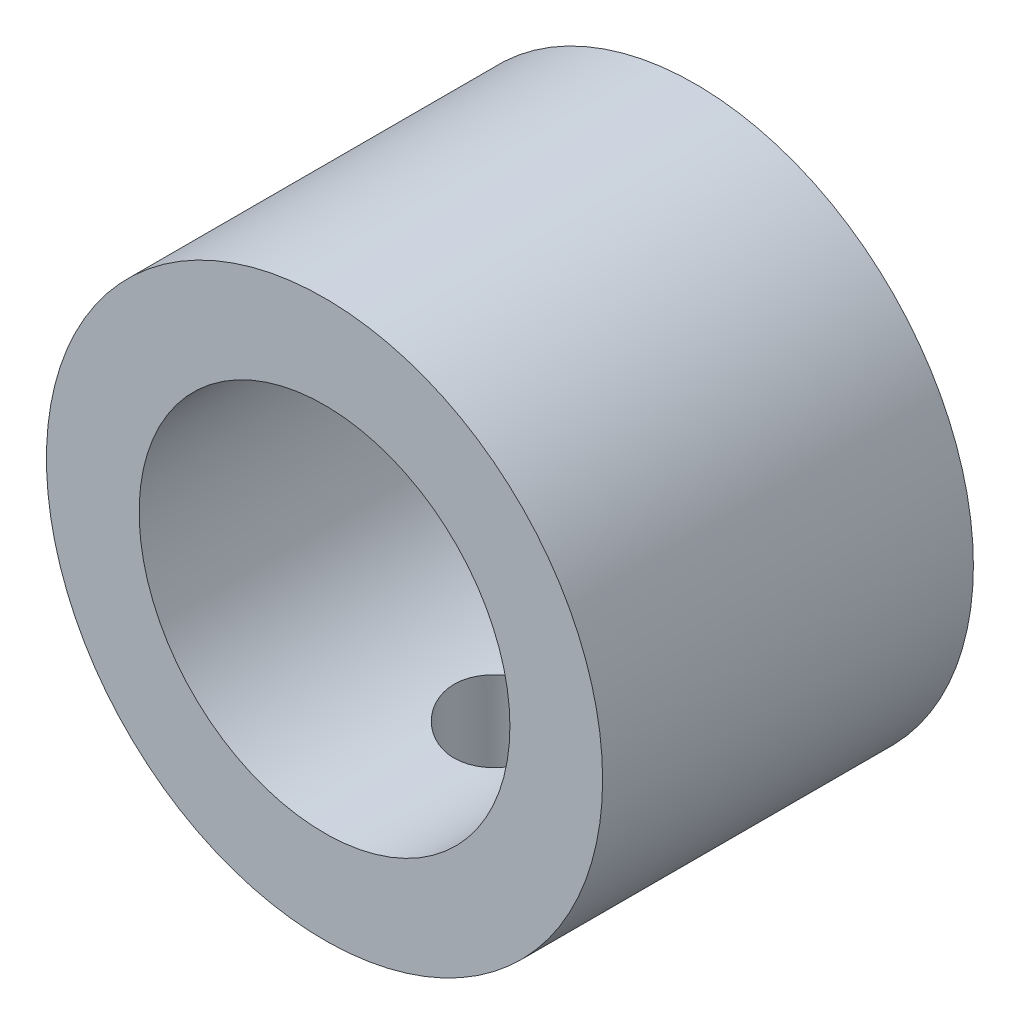
ISO-10303-21;
HEADER;
FILE_DESCRIPTION(('STEP AP214'),'2;1');
FILE_NAME('part.step','',(''),(''),'','','');
FILE_SCHEMA(('AUTOMOTIVE_DESIGN { 1 0 10303 214 1 1 1 1 }'));
ENDSEC;
DATA;
#1=APPLICATION_CONTEXT('core data for automotive mechanical design processes');
#2=APPLICATION_PROTOCOL_DEFINITION('international standard','automotive_design',2000,#1);
#3=PRODUCT_CONTEXT('',#1,'mechanical');
#4=PRODUCT('Part','Part','',(#3));
#5=PRODUCT_RELATED_PRODUCT_CATEGORY('part','',(#4));
#6=PRODUCT_DEFINITION_FORMATION('','',#4);
#7=PRODUCT_DEFINITION_CONTEXT('part definition',#1,'design');
#8=PRODUCT_DEFINITION('design','',#6,#7);
#9=PRODUCT_DEFINITION_SHAPE('','',#8);
#10=(LENGTH_UNIT() NAMED_UNIT(*) SI_UNIT(.MILLI.,.METRE.));
#11=(NAMED_UNIT(*) PLANE_ANGLE_UNIT() SI_UNIT($,.RADIAN.));
#12=(NAMED_UNIT(*) SI_UNIT($,.STERADIAN.) SOLID_ANGLE_UNIT());
#13=UNCERTAINTY_MEASURE_WITH_UNIT(LENGTH_MEASURE(1.E-05),#10,'distance_accuracy_value','');
#14=(GEOMETRIC_REPRESENTATION_CONTEXT(3) GLOBAL_UNCERTAINTY_ASSIGNED_CONTEXT((#13)) GLOBAL_UNIT_ASSIGNED_CONTEXT((#10,
#11,#12)) REPRESENTATION_CONTEXT('',''));
#15=CARTESIAN_POINT('',(0.,0.,0.));
#16=DIRECTION('',(0.,0.,1.));
#17=DIRECTION('',(1.,0.,0.));
#18=AXIS2_PLACEMENT_3D('',#15,#16,#17);
#19=CARTESIAN_POINT('',(0.,0.,5.));
#20=DIRECTION('',(0.,0.,1.));
#21=DIRECTION('',(1.,0.,0.));
#22=AXIS2_PLACEMENT_3D('',#19,#20,#21);
#23=PLANE('',#22);
#24=CARTESIAN_POINT('',(0.,0.,5.));
#25=DIRECTION('',(0.,0.,1.));
#26=DIRECTION('',(1.,0.,0.));
#27=AXIS2_PLACEMENT_3D('',#24,#25,#26);
#28=CIRCLE('',#27,7.5);
#29=CARTESIAN_POINT('',(7.5,0.,5.));
#30=VERTEX_POINT('',#29);
#31=EDGE_CURVE('E11',#30,#30,#28,.T.);
#32=ORIENTED_EDGE('',*,*,#31,.T.);
#33=EDGE_LOOP('',(#32));
#34=FACE_BOUND('',#33,.T.);
#35=CARTESIAN_POINT('',(0.,0.,5.));
#36=DIRECTION('',(0.,0.,1.));
#37=DIRECTION('',(1.,0.,0.));
#38=AXIS2_PLACEMENT_3D('',#35,#36,#37);
#39=CIRCLE('',#38,5.);
#40=CARTESIAN_POINT('',(5.,0.,5.));
#41=VERTEX_POINT('',#40);
#42=EDGE_CURVE('E55',#41,#41,#39,.T.);
#43=ORIENTED_EDGE('',*,*,#42,.F.);
#44=EDGE_LOOP('',(#43));
#45=FACE_BOUND('',#44,.T.);
#46=ADVANCED_FACE('F37',(#34,#45),#23,.T.);
#47=CARTESIAN_POINT('',(0.,0.,-5.));
#48=DIRECTION('',(0.,0.,1.));
#49=DIRECTION('',(1.,0.,0.));
#50=AXIS2_PLACEMENT_3D('',#47,#48,#49);
#51=PLANE('',#50);
#52=CARTESIAN_POINT('',(0.,0.,-5.));
#53=DIRECTION('',(0.,0.,1.));
#54=DIRECTION('',(1.,0.,0.));
#55=AXIS2_PLACEMENT_3D('',#52,#53,#54);
#56=CIRCLE('',#55,7.5);
#57=CARTESIAN_POINT('',(7.5,0.,-5.));
#58=VERTEX_POINT('',#57);
#59=EDGE_CURVE('E50',#58,#58,#56,.T.);
#60=ORIENTED_EDGE('',*,*,#59,.F.);
#61=EDGE_LOOP('',(#60));
#62=FACE_BOUND('',#61,.T.);
#63=CARTESIAN_POINT('',(0.,0.,-5.));
#64=DIRECTION('',(0.,0.,1.));
#65=DIRECTION('',(1.,0.,0.));
#66=AXIS2_PLACEMENT_3D('',#63,#64,#65);
#67=CIRCLE('',#66,5.);
#68=CARTESIAN_POINT('',(5.,0.,-5.));
#69=VERTEX_POINT('',#68);
#70=EDGE_CURVE('E57',#69,#69,#67,.T.);
#71=ORIENTED_EDGE('',*,*,#70,.T.);
#72=EDGE_LOOP('',(#71));
#73=FACE_BOUND('',#72,.T.);
#74=ADVANCED_FACE('F77',(#62,#73),#51,.F.);
#75=CARTESIAN_POINT('',(0.,0.,5.));
#76=DIRECTION('',(0.,0.,-1.));
#77=DIRECTION('',(-1.,0.,0.));
#78=AXIS2_PLACEMENT_3D('',#75,#76,#77);
#79=CYLINDRICAL_SURFACE('',#78,7.5);
#80=CARTESIAN_POINT('',(0.,-7.5,1.5));
#81=CARTESIAN_POINT('',(-0.0833653601889498,-7.49999846371307,1.49999693325248));
#82=CARTESIAN_POINT('',(-0.166769490302284,-7.49859577767346,1.49302673554853));
#83=CARTESIAN_POINT('',(-0.331220261533529,-7.49313548434847,1.46535224982713));
#84=CARTESIAN_POINT('',(-0.412264976312034,-7.48907576790279,1.44463705079774));
#85=CARTESIAN_POINT('',(-0.569595457894969,-7.4787547391743,1.39013808956882));
#86=CARTESIAN_POINT('',(-0.645885701899701,-7.47249553615077,1.35636684473297));
#87=CARTESIAN_POINT('',(-0.791711983296338,-7.45845597052971,1.27675162873306));
#88=CARTESIAN_POINT('',(-0.861248422613718,-7.4506756985356,1.23090837658919));
#89=CARTESIAN_POINT('',(-0.992540215972297,-7.43433247994955,1.12779225856285));
#90=CARTESIAN_POINT('',(-1.05419092673779,-7.42576118256521,1.0703874669132));
#91=CARTESIAN_POINT('',(-1.16705513491204,-7.40886270678882,0.946061375412447));
#92=CARTESIAN_POINT('',(-1.21826781715564,-7.40053554750636,0.879139332997323));
#93=CARTESIAN_POINT('',(-1.30924763002143,-7.38498662718923,0.736925710482187));
#94=CARTESIAN_POINT('',(-1.3489064082988,-7.37777561047419,0.661563534305461));
#95=CARTESIAN_POINT('',(-1.41495849987046,-7.36539402087627,0.505077271493881));
#96=CARTESIAN_POINT('',(-1.44135312365586,-7.36022324642942,0.423953754980482));
#97=CARTESIAN_POINT('',(-1.47978794982724,-7.35259207878307,0.259373454138124));
#98=CARTESIAN_POINT('',(-1.49201174693817,-7.35009705160781,0.175961183786661));
#99=CARTESIAN_POINT('',(-1.50232819158918,-7.34799562590941,0.00823526795348636));
#100=CARTESIAN_POINT('',(-1.50042228407025,-7.34838893201761,-0.0760782844802178));
#101=CARTESIAN_POINT('',(-1.48268185965273,-7.35198826722277,-0.241870182031505));
#102=CARTESIAN_POINT('',(-1.46705781036586,-7.35515179288145,-0.323372108440971));
#103=CARTESIAN_POINT('',(-1.42265682693458,-7.36386819240002,-0.482574114994503));
#104=CARTESIAN_POINT('',(-1.39387926465102,-7.36942118036668,-0.560274013378512));
#105=CARTESIAN_POINT('',(-1.32378717551208,-7.38233427750612,-0.710272892555398));
#106=CARTESIAN_POINT('',(-1.28238922684817,-7.38970634720557,-0.782531819353757));
#107=CARTESIAN_POINT('',(-1.18829036185902,-7.40541928159593,-0.919156274959221));
#108=CARTESIAN_POINT('',(-1.13558814653524,-7.41376025757549,-0.983520895276736));
#109=CARTESIAN_POINT('',(-1.01924990184088,-7.43065531862193,-1.1037441036854));
#110=CARTESIAN_POINT('',(-0.955434241818668,-7.43921053816357,-1.1594288517887));
#111=CARTESIAN_POINT('',(-0.819277536093015,-7.45543273071613,-1.25933076945184));
#112=CARTESIAN_POINT('',(-0.746936381069084,-7.4630996923346,-1.30354779194037));
#113=CARTESIAN_POINT('',(-0.595589080318381,-7.47670035241331,-1.37929126383896));
#114=CARTESIAN_POINT('',(-0.51657272937795,-7.48263133272408,-1.41079784046681));
#115=CARTESIAN_POINT('',(-0.354223464672997,-7.49207113481787,-1.46004071105785));
#116=CARTESIAN_POINT('',(-0.270891075108675,-7.49558025000797,-1.47777867311044));
#117=CARTESIAN_POINT('',(-0.103769108440726,-7.49974007800302,-1.49873468069142));
#118=CARTESIAN_POINT('',(-0.0200104924883644,-7.50043761978705,-1.5021906293104));
#119=CARTESIAN_POINT('',(0.146887401289071,-7.49902577895154,-1.49512521158673));
#120=CARTESIAN_POINT('',(0.23002671366569,-7.49691655412169,-1.48460463097111));
#121=CARTESIAN_POINT('',(0.392558489919811,-7.49015748012026,-1.45008243968407));
#122=CARTESIAN_POINT('',(0.471977922509855,-7.4855306460631,-1.42620289725315));
#123=CARTESIAN_POINT('',(0.625685441249501,-7.47425328091549,-1.36577402601629));
#124=CARTESIAN_POINT('',(0.699973142456309,-7.4676025982134,-1.32922374798476));
#125=CARTESIAN_POINT('',(0.842311760529326,-7.45289867299942,-1.24397626402303));
#126=CARTESIAN_POINT('',(0.910275190128282,-7.44482925655578,-1.19513582844158));
#127=CARTESIAN_POINT('',(1.03712702867881,-7.42822102244824,-1.08688621318908));
#128=CARTESIAN_POINT('',(1.09601446339614,-7.41968215452582,-1.0274759004002));
#129=CARTESIAN_POINT('',(1.20396088616126,-7.40293955335447,-0.898689972163314));
#130=CARTESIAN_POINT('',(1.25285655367298,-7.39474290349956,-0.829176383667994));
#131=CARTESIAN_POINT('',(1.33827813007681,-7.37976287694291,-0.682782957964981));
#132=CARTESIAN_POINT('',(1.37480453388435,-7.37297944370014,-0.605903415639671));
#133=CARTESIAN_POINT('',(1.43422776237294,-7.36165110876574,-0.447347630775677));
#134=CARTESIAN_POINT('',(1.45719524968658,-7.3570946230828,-0.365698738184521));
#135=CARTESIAN_POINT('',(1.48906297744079,-7.35071155188038,-0.199599819763642));
#136=CARTESIAN_POINT('',(1.49796505233767,-7.34888461036667,-0.115150160685979));
#137=CARTESIAN_POINT('',(1.5013813663012,-7.34818724447069,0.0525132968164782));
#138=CARTESIAN_POINT('',(1.49615368210634,-7.34926378783951,0.135721723390514));
#139=CARTESIAN_POINT('',(1.47202845615009,-7.35413360226921,0.30004747485754));
#140=CARTESIAN_POINT('',(1.45313102419395,-7.35792685150754,0.381164816542207));
#141=CARTESIAN_POINT('',(1.40231785274843,-7.36777896328738,0.538841566860818));
#142=CARTESIAN_POINT('',(1.37043376007602,-7.37383231528246,0.615411540753623));
#143=CARTESIAN_POINT('',(1.29458196690241,-7.38752572461255,0.762155581101662));
#144=CARTESIAN_POINT('',(1.25061325316232,-7.39516591498341,0.832329110587706));
#145=CARTESIAN_POINT('',(1.15095887217962,-7.41133440784838,0.965573358225471));
#146=CARTESIAN_POINT('',(1.09508683085277,-7.41987559364549,1.02850314790139));
#147=CARTESIAN_POINT('',(0.973596553519711,-7.43679122807932,1.14417930829376));
#148=CARTESIAN_POINT('',(0.907976080730003,-7.44516563794777,1.19692333547591));
#149=CARTESIAN_POINT('',(0.76802644363237,-7.46090748581957,1.29125196591967));
#150=CARTESIAN_POINT('',(0.693613326644752,-7.46826346828869,1.33271400492004));
#151=CARTESIAN_POINT('',(0.538749541411099,-7.481026876275,1.40247918389489));
#152=CARTESIAN_POINT('',(0.458304391294689,-7.48643605707924,1.43079418429874));
#153=CARTESIAN_POINT('',(0.314732233385669,-7.49364558893056,1.46797792206707));
#154=CARTESIAN_POINT('',(0.252422496020677,-7.49601454737677,1.47996479056164));
#155=CARTESIAN_POINT('',(0.1267492878151,-7.49919231209839,1.49597686853755));
#156=CARTESIAN_POINT('',(0.0633858506229286,-7.50000116809732,1.50000233176465));
#157=CARTESIAN_POINT('',(0.,-7.5,1.5));
#158=B_SPLINE_CURVE_WITH_KNOTS('',3,(#80,#81,#82,#83,#84,#85,#86,#87,#88,#89,#90,#91,#92,#93,
#94,#95,#96,#97,#98,#99,#100,#101,#102,#103,#104,#105,#106,#107,#108,#109,#110,#111,#112,#113,
#114,#115,#116,#117,#118,#119,#120,#121,#122,#123,#124,#125,#126,#127,#128,#129,#130,#131,#132,
#133,#134,#135,#136,#137,#138,#139,#140,#141,#142,#143,#144,#145,#146,#147,#148,#149,#150,#151,
#152,#153,#154,#155,#156,#157),.UNSPECIFIED.,.T.,.F.,(4,2,2,2,2,2,2,2,2,2,2,2,2,2,2,2,2,2,2,2,2,
2,2,2,2,2,2,2,2,2,2,2,2,2,2,2,2,2,4),(0.,0.249864195991888,0.499926976036985,0.749750602875513,
0.999559353346295,1.25239900516828,1.50525839512105,1.76041792508884,2.01555224047796,
2.26734277655381,2.51910756421838,2.76707590509417,3.01505608880594,3.26471235305389,
3.51439732124506,3.76857378737026,4.0227535130973,4.27732912281036,4.53187388547054,
4.78216103514398,5.03243411486801,5.28045680926085,5.52849808824034,5.77957599050038,
6.03068082518895,6.28560942868839,6.540527830852,6.79410571549085,7.04765052495622,
7.29659583851552,7.54553915238913,7.79387941879665,8.042240513728,8.29482114358715,
8.54745981799396,8.80274245013456,9.05779433276278,9.24778162934841,9.43776287056494),.UNSPECIFIED.);
#159=CARTESIAN_POINT('',(0.,-7.5,1.5));
#160=VERTEX_POINT('',#159);
#161=EDGE_CURVE('E62',#160,#160,#158,.T.);
#162=ORIENTED_EDGE('',*,*,#161,.F.);
#163=EDGE_LOOP('',(#162));
#164=FACE_BOUND('',#163,.T.);
#165=ORIENTED_EDGE('',*,*,#31,.F.);
#166=EDGE_LOOP('',(#165));
#167=FACE_BOUND('',#166,.T.);
#168=ORIENTED_EDGE('',*,*,#59,.T.);
#169=EDGE_LOOP('',(#168));
#170=FACE_BOUND('',#169,.T.);
#171=ADVANCED_FACE('F39',(#164,#167,#170),#79,.T.);
#172=CARTESIAN_POINT('',(0.,0.,5.));
#173=DIRECTION('',(0.,0.,-1.));
#174=DIRECTION('',(-1.,0.,0.));
#175=AXIS2_PLACEMENT_3D('',#172,#173,#174);
#176=CYLINDRICAL_SURFACE('',#175,5.);
#177=CARTESIAN_POINT('',(0.,-5.,1.5));
#178=CARTESIAN_POINT('',(0.0822886127532999,-4.9999992925055,1.49999900251511));
#179=CARTESIAN_POINT('',(0.164587318351529,-4.99794915693954,1.49320613637603));
#180=CARTESIAN_POINT('',(0.326788125304881,-4.98997105593691,1.4662786457779));
#181=CARTESIAN_POINT('',(0.40668950441142,-4.98404193389692,1.44614004197666));
#182=CARTESIAN_POINT('',(0.561732707754526,-4.96895552501836,1.39325398308974));
#183=CARTESIAN_POINT('',(0.636881364395373,-4.95980300250425,1.36052513038106));
#184=CARTESIAN_POINT('',(0.780624181053131,-4.93922109237645,1.28346390694416));
#185=CARTESIAN_POINT('',(0.849217467469669,-4.92779140192067,1.23912999260458));
#186=CARTESIAN_POINT('',(0.979871797183745,-4.90350737192774,1.13877599252733));
#187=CARTESIAN_POINT('',(1.04171807124434,-4.89062383657036,1.08248337411409));
#188=CARTESIAN_POINT('',(1.15524920923324,-4.86505834210442,0.960390770089816));
#189=CARTESIAN_POINT('',(1.20693236327441,-4.85237641724501,0.89458918787504));
#190=CARTESIAN_POINT('',(1.29980037723708,-4.82834113993772,0.753529246962389));
#191=CARTESIAN_POINT('',(1.34072309022213,-4.81702406663875,0.678091539009263));
#192=CARTESIAN_POINT('',(1.4092139477476,-4.79743620394031,0.521010745769708));
#193=CARTESIAN_POINT('',(1.43678529919973,-4.78916468313311,0.439369156072025));
#194=CARTESIAN_POINT('',(1.47701633682652,-4.77690870838434,0.27460973386954));
#195=CARTESIAN_POINT('',(1.49007196234677,-4.77281069324533,0.191597256136057));
#196=CARTESIAN_POINT('',(1.50213730614672,-4.76902789749767,0.0244668437832342));
#197=CARTESIAN_POINT('',(1.50115042761078,-4.76934204760571,-0.0596508180590877));
#198=CARTESIAN_POINT('',(1.48546977199812,-4.77424744067778,-0.223383908608484));
#199=CARTESIAN_POINT('',(1.47127205262685,-4.7786838859914,-0.303052250362239));
#200=CARTESIAN_POINT('',(1.43037420427056,-4.79108356228624,-0.45881978627346));
#201=CARTESIAN_POINT('',(1.40367284141641,-4.79904714132351,-0.534918627374333));
#202=CARTESIAN_POINT('',(1.33816026653682,-4.81772733074973,-0.682600349660739));
#203=CARTESIAN_POINT('',(1.29918816934642,-4.82848016115952,-0.754107083955262));
#204=CARTESIAN_POINT('',(1.21035222588683,-4.85150987000065,-0.889732022010192));
#205=CARTESIAN_POINT('',(1.16048574002588,-4.86378711746991,-0.953848429413778));
#206=CARTESIAN_POINT('',(1.04881290765546,-4.88911011297937,-1.07568619076202));
#207=CARTESIAN_POINT('',(0.986594907466972,-4.90216654310498,-1.13302866402967));
#208=CARTESIAN_POINT('',(0.853263259313967,-4.92712244063259,-1.23655398406425));
#209=CARTESIAN_POINT('',(0.782149051860888,-4.9390218351841,-1.28273612841443));
#210=CARTESIAN_POINT('',(0.632355038342803,-4.9604316006947,-1.36285992246473));
#211=CARTESIAN_POINT('',(0.55362774974795,-4.96992543668314,-1.39671751624986));
#212=CARTESIAN_POINT('',(0.391245415603519,-4.98533521832222,-1.45059959009963));
#213=CARTESIAN_POINT('',(0.307591751589581,-4.99125216186999,-1.47062792853249));
#214=CARTESIAN_POINT('',(0.140952242668331,-4.99868364643538,-1.49565217789939));
#215=CARTESIAN_POINT('',(0.0580500976011868,-5.0003485041779,-1.50116158580161));
#216=CARTESIAN_POINT('',(-0.107499605823383,-4.9995292324176,-1.49843084428792));
#217=CARTESIAN_POINT('',(-0.190147196690781,-4.99704565677756,-1.49019253034856));
#218=CARTESIAN_POINT('',(-0.350903605309697,-4.98830696987163,-1.4606153888885));
#219=CARTESIAN_POINT('',(-0.429072772614169,-4.98213829799417,-1.43957661241913));
#220=CARTESIAN_POINT('',(-0.580754638954522,-4.96674347841532,-1.3853567672218));
#221=CARTESIAN_POINT('',(-0.654266777025583,-4.95751696321085,-1.35217423896214));
#222=CARTESIAN_POINT('',(-0.796437189461052,-4.93669654351325,-1.27374683451887));
#223=CARTESIAN_POINT('',(-0.864943826199669,-4.92505280829675,-1.22824065905203));
#224=CARTESIAN_POINT('',(-0.993523307980147,-4.90073468764318,-1.12677524594719));
#225=CARTESIAN_POINT('',(-1.05359403235593,-4.8880600443108,-1.07081338811233));
#226=CARTESIAN_POINT('',(-1.16585744551027,-4.86253171869138,-0.947612691630655));
#227=CARTESIAN_POINT('',(-1.21768481231503,-4.84968825033268,-0.880038124228264));
#228=CARTESIAN_POINT('',(-1.30928995072154,-4.82576515238463,-0.736872060986468));
#229=CARTESIAN_POINT('',(-1.34906803829472,-4.81468547654651,-0.661280775441786));
#230=CARTESIAN_POINT('',(-1.41517347127168,-4.79567189615055,-0.504467508745313));
#231=CARTESIAN_POINT('',(-1.4415634693705,-4.78772337843827,-0.42327381346341));
#232=CARTESIAN_POINT('',(-1.48021730815114,-4.77591594362794,-0.257312031068523));
#233=CARTESIAN_POINT('',(-1.49248598978779,-4.772055625083,-0.172545179212332));
#234=CARTESIAN_POINT('',(-1.50221984485059,-4.76899972496087,-0.00563848162377277));
#235=CARTESIAN_POINT('',(-1.5002805530849,-4.76961647442754,0.0764636510175856));
#236=CARTESIAN_POINT('',(-1.48307505444813,-4.77499401288294,0.2391141033728));
#237=CARTESIAN_POINT('',(-1.46780938124716,-4.77975463592551,0.319662485176353));
#238=CARTESIAN_POINT('',(-1.42476888804136,-4.79275763670385,0.475945399142851));
#239=CARTESIAN_POINT('',(-1.39715175507068,-4.80095604545965,0.551727287361693));
#240=CARTESIAN_POINT('',(-1.33031507121129,-4.81990278909136,0.697642438817723));
#241=CARTESIAN_POINT('',(-1.29109329962876,-4.83065161194312,0.767774617640756));
#242=CARTESIAN_POINT('',(-1.20048763805072,-4.85397676425833,0.903163116527112));
#243=CARTESIAN_POINT('',(-1.14871276092994,-4.86660540163798,0.968148761260411));
#244=CARTESIAN_POINT('',(-1.03517434629782,-4.89201320450026,1.08870249830786));
#245=CARTESIAN_POINT('',(-0.973408217134502,-4.90479240823905,1.14426813946776));
#246=CARTESIAN_POINT('',(-0.839465762183249,-4.92950936570649,1.24602341229503));
#247=CARTESIAN_POINT('',(-0.767037885790608,-4.94141159765674,1.29189144685549));
#248=CARTESIAN_POINT('',(-0.61514137398353,-4.96260680455813,1.37073516990402));
#249=CARTESIAN_POINT('',(-0.535676052998956,-4.97190099931067,1.40371688827451));
#250=CARTESIAN_POINT('',(-0.380757712655282,-4.98602174969301,1.45289527565275));
#251=CARTESIAN_POINT('',(-0.305786961954234,-4.99122027381068,1.47051167288325));
#252=CARTESIAN_POINT('',(-0.15388019523078,-4.99820944494492,1.49406352524158));
#253=CARTESIAN_POINT('',(-0.0769445098581396,-5.0000006615474,1.50000093270482));
#254=CARTESIAN_POINT('',(0.,-5.,1.5));
#255=B_SPLINE_CURVE_WITH_KNOTS('',3,(#177,#178,#179,#180,#181,#182,#183,#184,#185,#186,#187,
#188,#189,#190,#191,#192,#193,#194,#195,#196,#197,#198,#199,#200,#201,#202,#203,#204,#205,#206,
#207,#208,#209,#210,#211,#212,#213,#214,#215,#216,#217,#218,#219,#220,#221,#222,#223,#224,#225,
#226,#227,#228,#229,#230,#231,#232,#233,#234,#235,#236,#237,#238,#239,#240,#241,#242,#243,#244,
#245,#246,#247,#248,#249,#250,#251,#252,#253,#254),.UNSPECIFIED.,.T.,.F.,(4,2,2,2,2,2,2,2,2,2,2,
2,2,2,2,2,2,2,2,2,2,2,2,2,2,2,2,2,2,2,2,2,2,2,2,2,2,2,4),(0.,0.246583203612611,
0.493239964845999,0.739533676300874,0.985860164412701,1.23855602948191,1.49129437288633,
1.74971481004109,2.00807314543224,2.25919689356599,2.51025978319089,2.75226016697676,
2.99428443658001,3.23962426447119,3.48502360158555,3.74067104048166,3.99633456531071,
4.25371046881688,4.51101453528808,4.75908809438545,5.00712853550327,5.24956746682327,
5.49203554593728,5.74011305702908,5.98825282000191,6.24540400322818,6.5025484425268,
6.75847814951252,7.01432009460283,7.25950155466943,7.504673196616,7.74680040402721,
7.98897397553107,8.2399692567993,8.49102974897502,8.7494299615667,9.00770911595235,
9.23831691930459,9.46888616948874),.UNSPECIFIED.);
#256=CARTESIAN_POINT('',(0.,-5.,1.5));
#257=VERTEX_POINT('',#256);
#258=EDGE_CURVE('E41',#257,#257,#255,.T.);
#259=ORIENTED_EDGE('',*,*,#258,.F.);
#260=EDGE_LOOP('',(#259));
#261=FACE_BOUND('',#260,.T.);
#262=ORIENTED_EDGE('',*,*,#42,.T.);
#263=EDGE_LOOP('',(#262));
#264=FACE_BOUND('',#263,.T.);
#265=ORIENTED_EDGE('',*,*,#70,.F.);
#266=EDGE_LOOP('',(#265));
#267=FACE_BOUND('',#266,.T.);
#268=ADVANCED_FACE('F71',(#261,#264,#267),#176,.F.);
#269=CARTESIAN_POINT('',(0.,-7.501,0.));
#270=DIRECTION('',(0.,1.,0.));
#271=DIRECTION('',(0.,0.,1.));
#272=AXIS2_PLACEMENT_3D('',#269,#270,#271);
#273=CYLINDRICAL_SURFACE('',#272,1.5);
#274=ORIENTED_EDGE('',*,*,#258,.T.);
#275=EDGE_LOOP('',(#274));
#276=FACE_BOUND('',#275,.T.);
#277=ORIENTED_EDGE('',*,*,#161,.T.);
#278=EDGE_LOOP('',(#277));
#279=FACE_BOUND('',#278,.T.);
#280=ADVANCED_FACE('F68',(#276,#279),#273,.F.);
#281=CLOSED_SHELL('',(#46,#74,#171,#268,#280));
#282=MANIFOLD_SOLID_BREP('B2',#281);
#283=ADVANCED_BREP_SHAPE_REPRESENTATION('',(#18,#282),#14);
#284=SHAPE_DEFINITION_REPRESENTATION(#9,#283);
ENDSEC;
END-ISO-10303-21;
